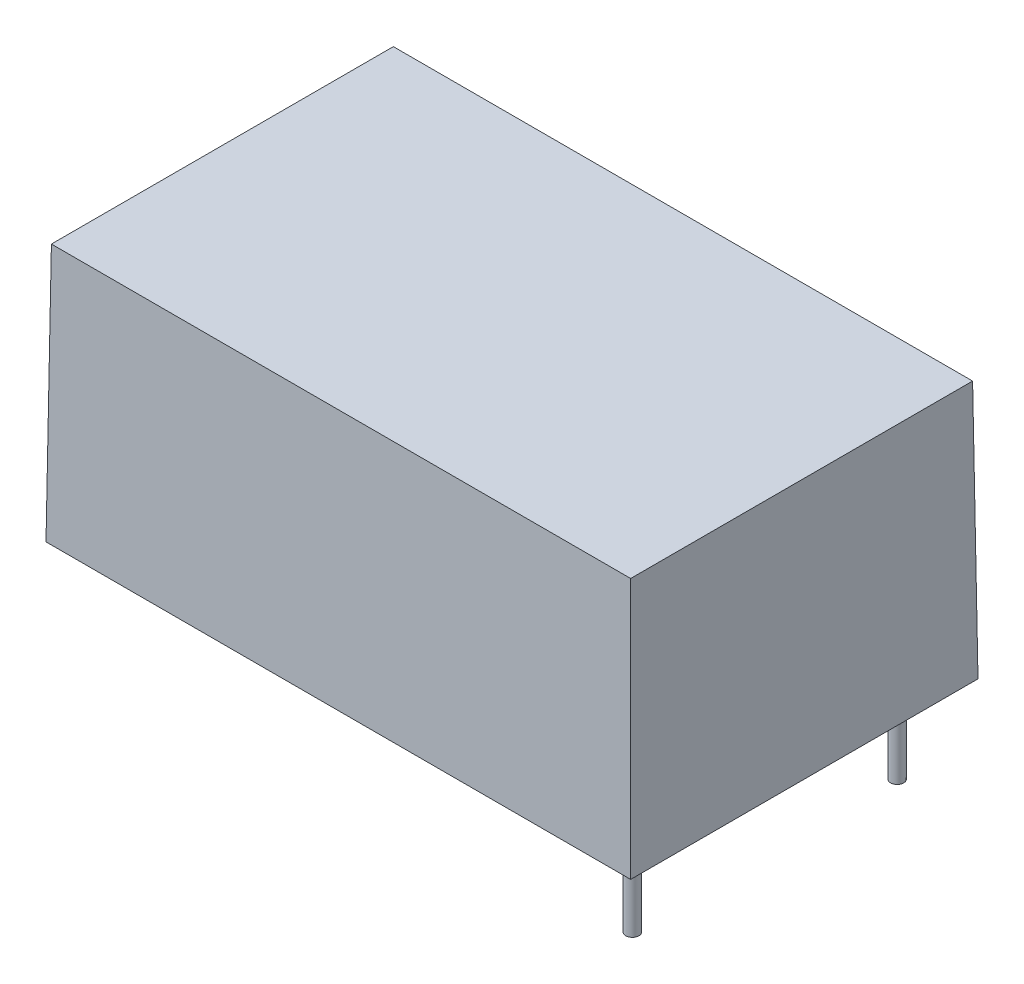
ISO-10303-21;
HEADER;
FILE_DESCRIPTION(('STEP AP214'),'2;1');
FILE_NAME('part.step','',(''),(''),'','','');
FILE_SCHEMA(('AUTOMOTIVE_DESIGN { 1 0 10303 214 1 1 1 1 }'));
ENDSEC;
DATA;
#1=APPLICATION_CONTEXT('core data for automotive mechanical design processes');
#2=APPLICATION_PROTOCOL_DEFINITION('international standard','automotive_design',2000,#1);
#3=PRODUCT_CONTEXT('',#1,'mechanical');
#4=PRODUCT('Part','Part','',(#3));
#5=PRODUCT_RELATED_PRODUCT_CATEGORY('part','',(#4));
#6=PRODUCT_DEFINITION_FORMATION('','',#4);
#7=PRODUCT_DEFINITION_CONTEXT('part definition',#1,'design');
#8=PRODUCT_DEFINITION('design','',#6,#7);
#9=PRODUCT_DEFINITION_SHAPE('','',#8);
#10=(LENGTH_UNIT() NAMED_UNIT(*) SI_UNIT(.MILLI.,.METRE.));
#11=(NAMED_UNIT(*) PLANE_ANGLE_UNIT() SI_UNIT($,.RADIAN.));
#12=(NAMED_UNIT(*) SI_UNIT($,.STERADIAN.) SOLID_ANGLE_UNIT());
#13=UNCERTAINTY_MEASURE_WITH_UNIT(LENGTH_MEASURE(1.E-05),#10,'distance_accuracy_value','');
#14=(GEOMETRIC_REPRESENTATION_CONTEXT(3) GLOBAL_UNCERTAINTY_ASSIGNED_CONTEXT((#13)) GLOBAL_UNIT_ASSIGNED_CONTEXT((#10,
#11,#12)) REPRESENTATION_CONTEXT('',''));
#15=CARTESIAN_POINT('',(0.,0.,0.));
#16=DIRECTION('',(0.,0.,1.));
#17=DIRECTION('',(1.,0.,0.));
#18=AXIS2_PLACEMENT_3D('',#15,#16,#17);
#19=CARTESIAN_POINT('',(-17.,0.,-10.1));
#20=DIRECTION('',(-0.999945169365512,0.0104717841162458,0.));
#21=DIRECTION('',(-0.0104717841162458,-0.999945169365512,0.));
#22=AXIS2_PLACEMENT_3D('',#19,#20,#21);
#23=PLANE('',#22);
#24=DIRECTION('',(0.,0.,1.));
#25=VECTOR('',#24,1.);
#26=CARTESIAN_POINT('',(-17.,0.,-10.1));
#27=LINE('',#26,#25);
#28=CARTESIAN_POINT('',(-17.,0.,-10.1));
#29=VERTEX_POINT('',#28);
#30=CARTESIAN_POINT('',(-17.,0.,10.1));
#31=VERTEX_POINT('',#30);
#32=EDGE_CURVE('E81',#29,#31,#27,.T.);
#33=ORIENTED_EDGE('',*,*,#32,.T.);
#34=DIRECTION('',(-0.0104712100046363,-0.999890347749231,0.0104712100046363));
#35=VECTOR('',#34,1.);
#36=CARTESIAN_POINT('',(-17.,0.,10.1));
#37=LINE('',#36,#35);
#38=CARTESIAN_POINT('',(-16.8429146251655,15.,9.94291462516554));
#39=VERTEX_POINT('',#38);
#40=EDGE_CURVE('E88',#39,#31,#37,.T.);
#41=ORIENTED_EDGE('',*,*,#40,.F.);
#42=DIRECTION('',(0.,0.,-1.));
#43=VECTOR('',#42,1.);
#44=CARTESIAN_POINT('',(-16.8429146251655,15.,-10.1));
#45=LINE('',#44,#43);
#46=CARTESIAN_POINT('',(-16.8429146251655,15.,-9.94291462516554));
#47=VERTEX_POINT('',#46);
#48=EDGE_CURVE('E106',#47,#39,#45,.F.);
#49=ORIENTED_EDGE('',*,*,#48,.F.);
#50=DIRECTION('',(-0.0104712100046363,-0.999890347749231,-0.0104712100046363));
#51=VECTOR('',#50,1.);
#52=CARTESIAN_POINT('',(-17.,0.,-10.1));
#53=LINE('',#52,#51);
#54=EDGE_CURVE('E96',#47,#29,#53,.T.);
#55=ORIENTED_EDGE('',*,*,#54,.T.);
#56=EDGE_LOOP('',(#33,#41,#49,#55));
#57=FACE_BOUND('',#56,.T.);
#58=ADVANCED_FACE('F35',(#57),#23,.T.);
#59=CARTESIAN_POINT('',(-17.,0.,10.1));
#60=DIRECTION('',(0.,0.0104717841162458,0.999945169365512));
#61=DIRECTION('',(0.,-0.999945169365512,0.0104717841162458));
#62=AXIS2_PLACEMENT_3D('',#59,#60,#61);
#63=PLANE('',#62);
#64=DIRECTION('',(1.,0.,0.));
#65=VECTOR('',#64,1.);
#66=CARTESIAN_POINT('',(-17.,0.,10.1));
#67=LINE('',#66,#65);
#68=CARTESIAN_POINT('',(17.,0.,10.1));
#69=VERTEX_POINT('',#68);
#70=EDGE_CURVE('E76',#31,#69,#67,.T.);
#71=ORIENTED_EDGE('',*,*,#70,.T.);
#72=DIRECTION('',(0.0104712100046363,-0.999890347749231,0.0104712100046363));
#73=VECTOR('',#72,1.);
#74=CARTESIAN_POINT('',(16.997785145973,0.211495248620399,10.097785145973));
#75=LINE('',#74,#73);
#76=CARTESIAN_POINT('',(16.8429146251655,15.,9.94291462516554));
#77=VERTEX_POINT('',#76);
#78=EDGE_CURVE('E93',#77,#69,#75,.T.);
#79=ORIENTED_EDGE('',*,*,#78,.F.);
#80=DIRECTION('',(-1.,0.,0.));
#81=VECTOR('',#80,1.);
#82=CARTESIAN_POINT('',(-17.,15.,9.94291462516554));
#83=LINE('',#82,#81);
#84=EDGE_CURVE('E89',#39,#77,#83,.F.);
#85=ORIENTED_EDGE('',*,*,#84,.F.);
#86=ORIENTED_EDGE('',*,*,#40,.T.);
#87=EDGE_LOOP('',(#71,#79,#85,#86));
#88=FACE_BOUND('',#87,.T.);
#89=ADVANCED_FACE('F37',(#88),#63,.T.);
#90=CARTESIAN_POINT('',(17.,0.,-10.1));
#91=DIRECTION('',(0.999945169365512,0.0104717841162458,0.));
#92=DIRECTION('',(-0.0104717841162458,0.999945169365512,0.));
#93=AXIS2_PLACEMENT_3D('',#90,#91,#92);
#94=PLANE('',#93);
#95=DIRECTION('',(0.,0.,-1.));
#96=VECTOR('',#95,1.);
#97=CARTESIAN_POINT('',(17.,0.,-10.1));
#98=LINE('',#97,#96);
#99=CARTESIAN_POINT('',(17.,0.,-10.1));
#100=VERTEX_POINT('',#99);
#101=EDGE_CURVE('E82',#69,#100,#98,.T.);
#102=ORIENTED_EDGE('',*,*,#101,.T.);
#103=DIRECTION('',(0.0104712100046363,-0.999890347749231,-0.0104712100046363));
#104=VECTOR('',#103,1.);
#105=CARTESIAN_POINT('',(16.9962720278753,0.355982101638295,-10.0962720278753));
#106=LINE('',#105,#104);
#107=CARTESIAN_POINT('',(16.8429146251655,15.,-9.94291462516554));
#108=VERTEX_POINT('',#107);
#109=EDGE_CURVE('E109',#108,#100,#106,.T.);
#110=ORIENTED_EDGE('',*,*,#109,.F.);
#111=DIRECTION('',(0.,0.,1.));
#112=VECTOR('',#111,1.);
#113=CARTESIAN_POINT('',(16.8429146251655,15.,-10.1));
#114=LINE('',#113,#112);
#115=EDGE_CURVE('E55',#77,#108,#114,.F.);
#116=ORIENTED_EDGE('',*,*,#115,.F.);
#117=ORIENTED_EDGE('',*,*,#78,.T.);
#118=EDGE_LOOP('',(#102,#110,#116,#117));
#119=FACE_BOUND('',#118,.T.);
#120=ADVANCED_FACE('F153',(#119),#94,.T.);
#121=CARTESIAN_POINT('',(-17.,0.,-10.1));
#122=DIRECTION('',(0.,0.0104717841162458,-0.999945169365512));
#123=DIRECTION('',(0.,0.999945169365512,0.0104717841162458));
#124=AXIS2_PLACEMENT_3D('',#121,#122,#123);
#125=PLANE('',#124);
#126=DIRECTION('',(-1.,0.,0.));
#127=VECTOR('',#126,1.);
#128=CARTESIAN_POINT('',(-17.,0.,-10.1));
#129=LINE('',#128,#127);
#130=EDGE_CURVE('E105',#100,#29,#129,.T.);
#131=ORIENTED_EDGE('',*,*,#130,.T.);
#132=ORIENTED_EDGE('',*,*,#54,.F.);
#133=DIRECTION('',(1.,0.,0.));
#134=VECTOR('',#133,1.);
#135=CARTESIAN_POINT('',(-17.,15.,-9.94291462516554));
#136=LINE('',#135,#134);
#137=EDGE_CURVE('E50',#108,#47,#136,.F.);
#138=ORIENTED_EDGE('',*,*,#137,.F.);
#139=ORIENTED_EDGE('',*,*,#109,.T.);
#140=EDGE_LOOP('',(#131,#132,#138,#139));
#141=FACE_BOUND('',#140,.T.);
#142=ADVANCED_FACE('F155',(#141),#125,.T.);
#143=CARTESIAN_POINT('',(0.,15.,0.));
#144=DIRECTION('',(0.,1.,0.));
#145=DIRECTION('',(0.,0.,1.));
#146=AXIS2_PLACEMENT_3D('',#143,#144,#145);
#147=PLANE('',#146);
#148=ORIENTED_EDGE('',*,*,#48,.T.);
#149=ORIENTED_EDGE('',*,*,#84,.T.);
#150=ORIENTED_EDGE('',*,*,#115,.T.);
#151=ORIENTED_EDGE('',*,*,#137,.T.);
#152=EDGE_LOOP('',(#148,#149,#150,#151));
#153=FACE_BOUND('',#152,.T.);
#154=ADVANCED_FACE('F129',(#153),#147,.T.);
#155=CARTESIAN_POINT('',(0.,0.,0.));
#156=DIRECTION('',(0.,1.,0.));
#157=DIRECTION('',(0.,0.,1.));
#158=AXIS2_PLACEMENT_3D('',#155,#156,#157);
#159=PLANE('',#158);
#160=CARTESIAN_POINT('',(-14.7,0.,-2.5));
#161=DIRECTION('',(0.,1.,0.));
#162=DIRECTION('',(0.,0.,1.));
#163=AXIS2_PLACEMENT_3D('',#160,#161,#162);
#164=CIRCLE('',#163,0.381);
#165=CARTESIAN_POINT('',(-14.7,0.,-2.119));
#166=VERTEX_POINT('',#165);
#167=EDGE_CURVE('E11',#166,#166,#164,.F.);
#168=ORIENTED_EDGE('',*,*,#167,.F.);
#169=EDGE_LOOP('',(#168));
#170=FACE_BOUND('',#169,.T.);
#171=CARTESIAN_POINT('',(14.7,0.,-7.7));
#172=DIRECTION('',(0.,1.,0.));
#173=DIRECTION('',(0.,0.,1.));
#174=AXIS2_PLACEMENT_3D('',#171,#172,#173);
#175=CIRCLE('',#174,0.381);
#176=CARTESIAN_POINT('',(14.7,0.,-7.319));
#177=VERTEX_POINT('',#176);
#178=EDGE_CURVE('E43',#177,#177,#175,.F.);
#179=ORIENTED_EDGE('',*,*,#178,.F.);
#180=EDGE_LOOP('',(#179));
#181=FACE_BOUND('',#180,.T.);
#182=CARTESIAN_POINT('',(14.7,0.,7.7));
#183=DIRECTION('',(0.,1.,0.));
#184=DIRECTION('',(0.,0.,1.));
#185=AXIS2_PLACEMENT_3D('',#182,#183,#184);
#186=CIRCLE('',#185,0.381);
#187=CARTESIAN_POINT('',(14.7,0.,8.081));
#188=VERTEX_POINT('',#187);
#189=EDGE_CURVE('E119',#188,#188,#186,.F.);
#190=ORIENTED_EDGE('',*,*,#189,.F.);
#191=EDGE_LOOP('',(#190));
#192=FACE_BOUND('',#191,.T.);
#193=CARTESIAN_POINT('',(-14.7,0.,2.5));
#194=DIRECTION('',(0.,1.,0.));
#195=DIRECTION('',(0.,0.,1.));
#196=AXIS2_PLACEMENT_3D('',#193,#194,#195);
#197=CIRCLE('',#196,0.381);
#198=CARTESIAN_POINT('',(-14.7,0.,2.881));
#199=VERTEX_POINT('',#198);
#200=EDGE_CURVE('E92',#199,#199,#197,.F.);
#201=ORIENTED_EDGE('',*,*,#200,.F.);
#202=EDGE_LOOP('',(#201));
#203=FACE_BOUND('',#202,.T.);
#204=ORIENTED_EDGE('',*,*,#32,.F.);
#205=ORIENTED_EDGE('',*,*,#130,.F.);
#206=ORIENTED_EDGE('',*,*,#101,.F.);
#207=ORIENTED_EDGE('',*,*,#70,.F.);
#208=EDGE_LOOP('',(#204,#205,#206,#207));
#209=FACE_BOUND('',#208,.T.);
#210=ADVANCED_FACE('F78',(#170,#181,#192,#203,#209),#159,.F.);
#211=CARTESIAN_POINT('',(-14.7,-5.,2.5));
#212=DIRECTION('',(0.,1.,0.));
#213=DIRECTION('',(0.,0.,1.));
#214=AXIS2_PLACEMENT_3D('',#211,#212,#213);
#215=CYLINDRICAL_SURFACE('',#214,0.381);
#216=CARTESIAN_POINT('',(-14.7,-5.,2.5));
#217=DIRECTION('',(0.,-1.,0.));
#218=DIRECTION('',(0.,0.,-1.));
#219=AXIS2_PLACEMENT_3D('',#216,#217,#218);
#220=CIRCLE('',#219,0.381);
#221=CARTESIAN_POINT('',(-14.7,-5.,2.119));
#222=VERTEX_POINT('',#221);
#223=EDGE_CURVE('E97',#222,#222,#220,.T.);
#224=ORIENTED_EDGE('',*,*,#223,.F.);
#225=EDGE_LOOP('',(#224));
#226=FACE_BOUND('',#225,.T.);
#227=ORIENTED_EDGE('',*,*,#200,.T.);
#228=EDGE_LOOP('',(#227));
#229=FACE_BOUND('',#228,.T.);
#230=ADVANCED_FACE('F128',(#226,#229),#215,.T.);
#231=CARTESIAN_POINT('',(-14.7,-5.,2.5));
#232=DIRECTION('',(0.,-1.,0.));
#233=DIRECTION('',(0.,0.,-1.));
#234=AXIS2_PLACEMENT_3D('',#231,#232,#233);
#235=PLANE('',#234);
#236=ORIENTED_EDGE('',*,*,#223,.T.);
#237=EDGE_LOOP('',(#236));
#238=FACE_BOUND('',#237,.T.);
#239=ADVANCED_FACE('F137',(#238),#235,.T.);
#240=CARTESIAN_POINT('',(14.7,-5.,7.7));
#241=DIRECTION('',(0.,1.,0.));
#242=DIRECTION('',(0.,0.,1.));
#243=AXIS2_PLACEMENT_3D('',#240,#241,#242);
#244=CYLINDRICAL_SURFACE('',#243,0.381);
#245=CARTESIAN_POINT('',(14.7,-5.,7.7));
#246=DIRECTION('',(0.,-1.,0.));
#247=DIRECTION('',(0.,0.,-1.));
#248=AXIS2_PLACEMENT_3D('',#245,#246,#247);
#249=CIRCLE('',#248,0.381);
#250=CARTESIAN_POINT('',(14.7,-5.,7.319));
#251=VERTEX_POINT('',#250);
#252=EDGE_CURVE('E100',#251,#251,#249,.T.);
#253=ORIENTED_EDGE('',*,*,#252,.F.);
#254=EDGE_LOOP('',(#253));
#255=FACE_BOUND('',#254,.T.);
#256=ORIENTED_EDGE('',*,*,#189,.T.);
#257=EDGE_LOOP('',(#256));
#258=FACE_BOUND('',#257,.T.);
#259=ADVANCED_FACE('F143',(#255,#258),#244,.T.);
#260=CARTESIAN_POINT('',(14.7,-5.,7.7));
#261=DIRECTION('',(0.,-1.,0.));
#262=DIRECTION('',(0.,0.,-1.));
#263=AXIS2_PLACEMENT_3D('',#260,#261,#262);
#264=PLANE('',#263);
#265=ORIENTED_EDGE('',*,*,#252,.T.);
#266=EDGE_LOOP('',(#265));
#267=FACE_BOUND('',#266,.T.);
#268=ADVANCED_FACE('F190',(#267),#264,.T.);
#269=CARTESIAN_POINT('',(14.7,-5.,-7.7));
#270=DIRECTION('',(0.,1.,0.));
#271=DIRECTION('',(0.,0.,1.));
#272=AXIS2_PLACEMENT_3D('',#269,#270,#271);
#273=CYLINDRICAL_SURFACE('',#272,0.381);
#274=CARTESIAN_POINT('',(14.7,-5.,-7.7));
#275=DIRECTION('',(0.,-1.,0.));
#276=DIRECTION('',(0.,0.,1.));
#277=AXIS2_PLACEMENT_3D('',#274,#275,#276);
#278=CIRCLE('',#277,0.381);
#279=CARTESIAN_POINT('',(14.7,-5.,-7.319));
#280=VERTEX_POINT('',#279);
#281=EDGE_CURVE('E246',#280,#280,#278,.T.);
#282=ORIENTED_EDGE('',*,*,#281,.F.);
#283=EDGE_LOOP('',(#282));
#284=FACE_BOUND('',#283,.T.);
#285=ORIENTED_EDGE('',*,*,#178,.T.);
#286=EDGE_LOOP('',(#285));
#287=FACE_BOUND('',#286,.T.);
#288=ADVANCED_FACE('F124',(#284,#287),#273,.T.);
#289=CARTESIAN_POINT('',(14.7,-5.,-7.7));
#290=DIRECTION('',(0.,1.,0.));
#291=DIRECTION('',(0.,0.,1.));
#292=AXIS2_PLACEMENT_3D('',#289,#290,#291);
#293=PLANE('',#292);
#294=ORIENTED_EDGE('',*,*,#281,.T.);
#295=EDGE_LOOP('',(#294));
#296=FACE_BOUND('',#295,.T.);
#297=ADVANCED_FACE('F209',(#296),#293,.F.);
#298=CARTESIAN_POINT('',(-14.7,-5.,-2.5));
#299=DIRECTION('',(0.,1.,0.));
#300=DIRECTION('',(0.,0.,1.));
#301=AXIS2_PLACEMENT_3D('',#298,#299,#300);
#302=CYLINDRICAL_SURFACE('',#301,0.381);
#303=CARTESIAN_POINT('',(-14.7,-5.,-2.5));
#304=DIRECTION('',(0.,-1.,0.));
#305=DIRECTION('',(0.,0.,1.));
#306=AXIS2_PLACEMENT_3D('',#303,#304,#305);
#307=CIRCLE('',#306,0.381);
#308=CARTESIAN_POINT('',(-14.7,-5.,-2.119));
#309=VERTEX_POINT('',#308);
#310=EDGE_CURVE('E245',#309,#309,#307,.T.);
#311=ORIENTED_EDGE('',*,*,#310,.F.);
#312=EDGE_LOOP('',(#311));
#313=FACE_BOUND('',#312,.T.);
#314=ORIENTED_EDGE('',*,*,#167,.T.);
#315=EDGE_LOOP('',(#314));
#316=FACE_BOUND('',#315,.T.);
#317=ADVANCED_FACE('F219',(#313,#316),#302,.T.);
#318=CARTESIAN_POINT('',(-14.7,-5.,-2.5));
#319=DIRECTION('',(0.,1.,0.));
#320=DIRECTION('',(0.,0.,1.));
#321=AXIS2_PLACEMENT_3D('',#318,#319,#320);
#322=PLANE('',#321);
#323=ORIENTED_EDGE('',*,*,#310,.T.);
#324=EDGE_LOOP('',(#323));
#325=FACE_BOUND('',#324,.T.);
#326=ADVANCED_FACE('F229',(#325),#322,.F.);
#327=CLOSED_SHELL('',(#58,#89,#120,#142,#154,#210,#230,#239,#259,#268,#288,#297,#317,#326));
#328=MANIFOLD_SOLID_BREP('B2',#327);
#329=ADVANCED_BREP_SHAPE_REPRESENTATION('',(#18,#328),#14);
#330=SHAPE_DEFINITION_REPRESENTATION(#9,#329);
ENDSEC;
END-ISO-10303-21;
